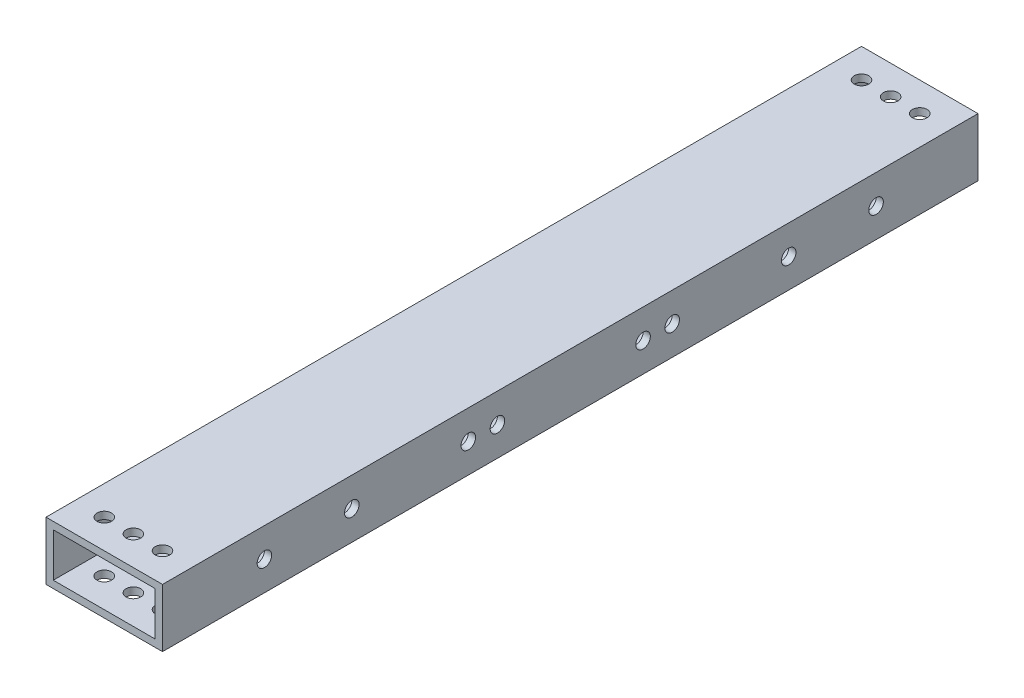
ISO-10303-21;
HEADER;
FILE_DESCRIPTION(('STEP AP214'),'2;1');
FILE_NAME('part.step','',(''),(''),'','','');
FILE_SCHEMA(('AUTOMOTIVE_DESIGN { 1 0 10303 214 1 1 1 1 }'));
ENDSEC;
DATA;
#1=APPLICATION_CONTEXT('core data for automotive mechanical design processes');
#2=APPLICATION_PROTOCOL_DEFINITION('international standard','automotive_design',2000,#1);
#3=PRODUCT_CONTEXT('',#1,'mechanical');
#4=PRODUCT('Part','Part','',(#3));
#5=PRODUCT_RELATED_PRODUCT_CATEGORY('part','',(#4));
#6=PRODUCT_DEFINITION_FORMATION('','',#4);
#7=PRODUCT_DEFINITION_CONTEXT('part definition',#1,'design');
#8=PRODUCT_DEFINITION('design','',#6,#7);
#9=PRODUCT_DEFINITION_SHAPE('','',#8);
#10=(LENGTH_UNIT() NAMED_UNIT(*) SI_UNIT(.MILLI.,.METRE.));
#11=(NAMED_UNIT(*) PLANE_ANGLE_UNIT() SI_UNIT($,.RADIAN.));
#12=(NAMED_UNIT(*) SI_UNIT($,.STERADIAN.) SOLID_ANGLE_UNIT());
#13=UNCERTAINTY_MEASURE_WITH_UNIT(LENGTH_MEASURE(1.E-05),#10,'distance_accuracy_value','');
#14=(GEOMETRIC_REPRESENTATION_CONTEXT(3) GLOBAL_UNCERTAINTY_ASSIGNED_CONTEXT((#13)) GLOBAL_UNIT_ASSIGNED_CONTEXT((#10,
#11,#12)) REPRESENTATION_CONTEXT('',''));
#15=CARTESIAN_POINT('',(0.,0.,0.));
#16=DIRECTION('',(0.,0.,1.));
#17=DIRECTION('',(1.,0.,0.));
#18=AXIS2_PLACEMENT_3D('',#15,#16,#17);
#19=CARTESIAN_POINT('',(0.,25.4,355.6));
#20=DIRECTION('',(0.,-1.,0.));
#21=DIRECTION('',(0.,0.,-1.));
#22=AXIS2_PLACEMENT_3D('',#19,#20,#21);
#23=PLANE('',#22);
#24=CARTESIAN_POINT('',(12.7,25.4,12.7));
#25=DIRECTION('',(0.,1.,0.));
#26=DIRECTION('',(0.,0.,1.));
#27=AXIS2_PLACEMENT_3D('',#24,#25,#26);
#28=CIRCLE('',#27,3.17499999999999);
#29=CARTESIAN_POINT('',(12.7,25.4,15.875));
#30=VERTEX_POINT('',#29);
#31=EDGE_CURVE('E839',#30,#30,#28,.T.);
#32=ORIENTED_EDGE('',*,*,#31,.F.);
#33=EDGE_LOOP('',(#32));
#34=FACE_BOUND('',#33,.T.);
#35=CARTESIAN_POINT('',(25.4,25.4,12.7));
#36=DIRECTION('',(0.,1.,0.));
#37=DIRECTION('',(0.,0.,1.));
#38=AXIS2_PLACEMENT_3D('',#35,#36,#37);
#39=CIRCLE('',#38,3.17499999999999);
#40=CARTESIAN_POINT('',(25.4,25.4,15.875));
#41=VERTEX_POINT('',#40);
#42=EDGE_CURVE('E284',#41,#41,#39,.T.);
#43=ORIENTED_EDGE('',*,*,#42,.F.);
#44=EDGE_LOOP('',(#43));
#45=FACE_BOUND('',#44,.T.);
#46=CARTESIAN_POINT('',(38.1,25.4,12.7));
#47=DIRECTION('',(0.,1.,0.));
#48=DIRECTION('',(0.,0.,1.));
#49=AXIS2_PLACEMENT_3D('',#46,#47,#48);
#50=CIRCLE('',#49,3.17499999999999);
#51=CARTESIAN_POINT('',(38.1,25.4,15.875));
#52=VERTEX_POINT('',#51);
#53=EDGE_CURVE('E281',#52,#52,#50,.T.);
#54=ORIENTED_EDGE('',*,*,#53,.F.);
#55=EDGE_LOOP('',(#54));
#56=FACE_BOUND('',#55,.T.);
#57=CARTESIAN_POINT('',(12.7000000000001,25.4,342.9));
#58=DIRECTION('',(0.,1.,0.));
#59=DIRECTION('',(0.,0.,1.));
#60=AXIS2_PLACEMENT_3D('',#57,#58,#59);
#61=CIRCLE('',#60,3.17499999999999);
#62=CARTESIAN_POINT('',(12.7000000000001,25.4,346.075));
#63=VERTEX_POINT('',#62);
#64=EDGE_CURVE('E303',#63,#63,#61,.T.);
#65=ORIENTED_EDGE('',*,*,#64,.F.);
#66=EDGE_LOOP('',(#65));
#67=FACE_BOUND('',#66,.T.);
#68=CARTESIAN_POINT('',(25.4000000000001,25.4,342.9));
#69=DIRECTION('',(0.,1.,0.));
#70=DIRECTION('',(0.,0.,1.));
#71=AXIS2_PLACEMENT_3D('',#68,#69,#70);
#72=CIRCLE('',#71,3.17499999999999);
#73=CARTESIAN_POINT('',(25.4000000000001,25.4,346.075));
#74=VERTEX_POINT('',#73);
#75=EDGE_CURVE('E313',#74,#74,#72,.T.);
#76=ORIENTED_EDGE('',*,*,#75,.F.);
#77=EDGE_LOOP('',(#76));
#78=FACE_BOUND('',#77,.T.);
#79=DIRECTION('',(-1.,0.,0.));
#80=VECTOR('',#79,1.);
#81=CARTESIAN_POINT('',(0.,25.4,0.));
#82=LINE('',#81,#80);
#83=CARTESIAN_POINT('',(50.8,25.4,0.));
#84=VERTEX_POINT('',#83);
#85=CARTESIAN_POINT('',(0.,25.4,0.));
#86=VERTEX_POINT('',#85);
#87=EDGE_CURVE('E169',#84,#86,#82,.T.);
#88=ORIENTED_EDGE('',*,*,#87,.T.);
#89=DIRECTION('',(0.,0.,-1.));
#90=VECTOR('',#89,1.);
#91=CARTESIAN_POINT('',(0.,25.4,355.6));
#92=LINE('',#91,#90);
#93=CARTESIAN_POINT('',(0.,25.4,355.6));
#94=VERTEX_POINT('',#93);
#95=EDGE_CURVE('E178',#94,#86,#92,.T.);
#96=ORIENTED_EDGE('',*,*,#95,.F.);
#97=DIRECTION('',(-1.,0.,0.));
#98=VECTOR('',#97,1.);
#99=CARTESIAN_POINT('',(0.,25.4,355.6));
#100=LINE('',#99,#98);
#101=CARTESIAN_POINT('',(50.8,25.4,355.6));
#102=VERTEX_POINT('',#101);
#103=EDGE_CURVE('E175',#102,#94,#100,.T.);
#104=ORIENTED_EDGE('',*,*,#103,.F.);
#105=DIRECTION('',(0.,0.,-1.));
#106=VECTOR('',#105,1.);
#107=CARTESIAN_POINT('',(50.8,25.4,355.6));
#108=LINE('',#107,#106);
#109=EDGE_CURVE('E193',#102,#84,#108,.T.);
#110=ORIENTED_EDGE('',*,*,#109,.T.);
#111=EDGE_LOOP('',(#88,#96,#104,#110));
#112=FACE_BOUND('',#111,.T.);
#113=CARTESIAN_POINT('',(38.1000000000001,25.4,342.9));
#114=DIRECTION('',(0.,1.,0.));
#115=DIRECTION('',(0.,0.,1.));
#116=AXIS2_PLACEMENT_3D('',#113,#114,#115);
#117=CIRCLE('',#116,3.17499999999998);
#118=CARTESIAN_POINT('',(38.1000000000001,25.4,346.075));
#119=VERTEX_POINT('',#118);
#120=EDGE_CURVE('E323',#119,#119,#117,.T.);
#121=ORIENTED_EDGE('',*,*,#120,.F.);
#122=EDGE_LOOP('',(#121));
#123=FACE_BOUND('',#122,.T.);
#124=ADVANCED_FACE('F45',(#34,#45,#56,#67,#78,#112,#123),#23,.F.);
#125=CARTESIAN_POINT('',(0.,0.,355.6));
#126=DIRECTION('',(0.,0.,-1.));
#127=DIRECTION('',(-1.,0.,0.));
#128=AXIS2_PLACEMENT_3D('',#125,#126,#127);
#129=PLANE('',#128);
#130=DIRECTION('',(0.,-1.,0.));
#131=VECTOR('',#130,1.);
#132=CARTESIAN_POINT('',(0.,0.,355.6));
#133=LINE('',#132,#131);
#134=CARTESIAN_POINT('',(0.,0.,355.6));
#135=VERTEX_POINT('',#134);
#136=EDGE_CURVE('E164',#94,#135,#133,.T.);
#137=ORIENTED_EDGE('',*,*,#136,.T.);
#138=DIRECTION('',(1.,0.,0.));
#139=VECTOR('',#138,1.);
#140=CARTESIAN_POINT('',(0.,0.,355.6));
#141=LINE('',#140,#139);
#142=CARTESIAN_POINT('',(50.8,0.,355.6));
#143=VERTEX_POINT('',#142);
#144=EDGE_CURVE('E168',#135,#143,#141,.T.);
#145=ORIENTED_EDGE('',*,*,#144,.T.);
#146=DIRECTION('',(0.,1.,0.));
#147=VECTOR('',#146,1.);
#148=CARTESIAN_POINT('',(50.8,0.,355.6));
#149=LINE('',#148,#147);
#150=EDGE_CURVE('E172',#143,#102,#149,.T.);
#151=ORIENTED_EDGE('',*,*,#150,.T.);
#152=ORIENTED_EDGE('',*,*,#103,.T.);
#153=EDGE_LOOP('',(#137,#145,#151,#152));
#154=FACE_BOUND('',#153,.T.);
#155=DIRECTION('',(0.,-1.,0.));
#156=VECTOR('',#155,1.);
#157=CARTESIAN_POINT('',(3.175,3.175,355.6));
#158=LINE('',#157,#156);
#159=CARTESIAN_POINT('',(3.175,22.225,355.6));
#160=VERTEX_POINT('',#159);
#161=CARTESIAN_POINT('',(3.175,3.175,355.6));
#162=VERTEX_POINT('',#161);
#163=EDGE_CURVE('E113',#160,#162,#158,.T.);
#164=ORIENTED_EDGE('',*,*,#163,.F.);
#165=DIRECTION('',(-1.,0.,0.));
#166=VECTOR('',#165,1.);
#167=CARTESIAN_POINT('',(3.175,22.225,355.6));
#168=LINE('',#167,#166);
#169=CARTESIAN_POINT('',(47.625,22.225,355.6));
#170=VERTEX_POINT('',#169);
#171=EDGE_CURVE('E140',#170,#160,#168,.T.);
#172=ORIENTED_EDGE('',*,*,#171,.F.);
#173=DIRECTION('',(0.,1.,0.));
#174=VECTOR('',#173,1.);
#175=CARTESIAN_POINT('',(47.625,3.175,355.6));
#176=LINE('',#175,#174);
#177=CARTESIAN_POINT('',(47.625,3.175,355.6));
#178=VERTEX_POINT('',#177);
#179=EDGE_CURVE('E136',#178,#170,#176,.T.);
#180=ORIENTED_EDGE('',*,*,#179,.F.);
#181=DIRECTION('',(1.,0.,0.));
#182=VECTOR('',#181,1.);
#183=CARTESIAN_POINT('',(3.175,3.175,355.6));
#184=LINE('',#183,#182);
#185=EDGE_CURVE('E122',#162,#178,#184,.T.);
#186=ORIENTED_EDGE('',*,*,#185,.F.);
#187=EDGE_LOOP('',(#164,#172,#180,#186));
#188=FACE_BOUND('',#187,.T.);
#189=ADVANCED_FACE('F135',(#154,#188),#129,.F.);
#190=CARTESIAN_POINT('',(0.,0.,0.));
#191=DIRECTION('',(0.,0.,-1.));
#192=DIRECTION('',(-1.,0.,0.));
#193=AXIS2_PLACEMENT_3D('',#190,#191,#192);
#194=PLANE('',#193);
#195=DIRECTION('',(0.,-1.,0.));
#196=VECTOR('',#195,1.);
#197=CARTESIAN_POINT('',(0.,0.,0.));
#198=LINE('',#197,#196);
#199=CARTESIAN_POINT('',(0.,0.,0.));
#200=VERTEX_POINT('',#199);
#201=EDGE_CURVE('E131',#86,#200,#198,.T.);
#202=ORIENTED_EDGE('',*,*,#201,.F.);
#203=ORIENTED_EDGE('',*,*,#87,.F.);
#204=DIRECTION('',(0.,1.,0.));
#205=VECTOR('',#204,1.);
#206=CARTESIAN_POINT('',(50.8,0.,0.));
#207=LINE('',#206,#205);
#208=CARTESIAN_POINT('',(50.8,0.,0.));
#209=VERTEX_POINT('',#208);
#210=EDGE_CURVE('E185',#209,#84,#207,.T.);
#211=ORIENTED_EDGE('',*,*,#210,.F.);
#212=DIRECTION('',(1.,0.,0.));
#213=VECTOR('',#212,1.);
#214=CARTESIAN_POINT('',(0.,0.,0.));
#215=LINE('',#214,#213);
#216=EDGE_CURVE('E182',#200,#209,#215,.T.);
#217=ORIENTED_EDGE('',*,*,#216,.F.);
#218=EDGE_LOOP('',(#202,#203,#211,#217));
#219=FACE_BOUND('',#218,.T.);
#220=DIRECTION('',(-1.,0.,0.));
#221=VECTOR('',#220,1.);
#222=CARTESIAN_POINT('',(3.175,22.225,0.));
#223=LINE('',#222,#221);
#224=CARTESIAN_POINT('',(47.625,22.225,0.));
#225=VERTEX_POINT('',#224);
#226=CARTESIAN_POINT('',(3.175,22.225,0.));
#227=VERTEX_POINT('',#226);
#228=EDGE_CURVE('E123',#225,#227,#223,.T.);
#229=ORIENTED_EDGE('',*,*,#228,.T.);
#230=DIRECTION('',(0.,-1.,0.));
#231=VECTOR('',#230,1.);
#232=CARTESIAN_POINT('',(3.175,3.175,0.));
#233=LINE('',#232,#231);
#234=CARTESIAN_POINT('',(3.175,3.175,0.));
#235=VERTEX_POINT('',#234);
#236=EDGE_CURVE('E71',#227,#235,#233,.T.);
#237=ORIENTED_EDGE('',*,*,#236,.T.);
#238=DIRECTION('',(1.,0.,0.));
#239=VECTOR('',#238,1.);
#240=CARTESIAN_POINT('',(3.175,3.175,0.));
#241=LINE('',#240,#239);
#242=CARTESIAN_POINT('',(47.625,3.175,0.));
#243=VERTEX_POINT('',#242);
#244=EDGE_CURVE('E129',#235,#243,#241,.T.);
#245=ORIENTED_EDGE('',*,*,#244,.T.);
#246=DIRECTION('',(0.,1.,0.));
#247=VECTOR('',#246,1.);
#248=CARTESIAN_POINT('',(47.625,3.175,0.));
#249=LINE('',#248,#247);
#250=EDGE_CURVE('E151',#243,#225,#249,.T.);
#251=ORIENTED_EDGE('',*,*,#250,.T.);
#252=EDGE_LOOP('',(#229,#237,#245,#251));
#253=FACE_BOUND('',#252,.T.);
#254=ADVANCED_FACE('F443',(#219,#253),#194,.T.);
#255=CARTESIAN_POINT('',(0.,0.,355.6));
#256=DIRECTION('',(1.,0.,0.));
#257=DIRECTION('',(0.,0.,-1.));
#258=AXIS2_PLACEMENT_3D('',#255,#256,#257);
#259=PLANE('',#258);
#260=CARTESIAN_POINT('',(0.,12.7000000000001,311.15));
#261=DIRECTION('',(1.,0.,0.));
#262=DIRECTION('',(0.,0.,-1.));
#263=AXIS2_PLACEMENT_3D('',#260,#261,#262);
#264=CIRCLE('',#263,3.17500000000003);
#265=CARTESIAN_POINT('',(0.,12.7000000000001,307.975));
#266=VERTEX_POINT('',#265);
#267=EDGE_CURVE('E148',#266,#266,#264,.T.);
#268=ORIENTED_EDGE('',*,*,#267,.T.);
#269=EDGE_LOOP('',(#268));
#270=FACE_BOUND('',#269,.T.);
#271=CARTESIAN_POINT('',(0.,12.7000000000001,273.05));
#272=DIRECTION('',(1.,0.,0.));
#273=DIRECTION('',(0.,0.,-1.));
#274=AXIS2_PLACEMENT_3D('',#271,#272,#273);
#275=CIRCLE('',#274,3.17499999999997);
#276=CARTESIAN_POINT('',(0.,12.7000000000001,269.875));
#277=VERTEX_POINT('',#276);
#278=EDGE_CURVE('E247',#277,#277,#275,.T.);
#279=ORIENTED_EDGE('',*,*,#278,.T.);
#280=EDGE_LOOP('',(#279));
#281=FACE_BOUND('',#280,.T.);
#282=CARTESIAN_POINT('',(0.,12.7000000000001,222.25));
#283=DIRECTION('',(1.,0.,0.));
#284=DIRECTION('',(0.,0.,-1.));
#285=AXIS2_PLACEMENT_3D('',#282,#283,#284);
#286=CIRCLE('',#285,3.175);
#287=CARTESIAN_POINT('',(0.,12.7000000000001,219.075));
#288=VERTEX_POINT('',#287);
#289=EDGE_CURVE('E241',#288,#288,#286,.T.);
#290=ORIENTED_EDGE('',*,*,#289,.T.);
#291=EDGE_LOOP('',(#290));
#292=FACE_BOUND('',#291,.T.);
#293=CARTESIAN_POINT('',(0.,12.7000000000001,146.05));
#294=DIRECTION('',(1.,0.,0.));
#295=DIRECTION('',(0.,0.,-1.));
#296=AXIS2_PLACEMENT_3D('',#293,#294,#295);
#297=CIRCLE('',#296,3.175);
#298=CARTESIAN_POINT('',(0.,12.7000000000001,142.875));
#299=VERTEX_POINT('',#298);
#300=EDGE_CURVE('E235',#299,#299,#297,.T.);
#301=ORIENTED_EDGE('',*,*,#300,.T.);
#302=EDGE_LOOP('',(#301));
#303=FACE_BOUND('',#302,.T.);
#304=CARTESIAN_POINT('',(0.,12.7000000000001,82.55));
#305=DIRECTION('',(1.,0.,0.));
#306=DIRECTION('',(0.,0.,-1.));
#307=AXIS2_PLACEMENT_3D('',#304,#305,#306);
#308=CIRCLE('',#307,3.175);
#309=CARTESIAN_POINT('',(0.,12.7000000000001,79.375));
#310=VERTEX_POINT('',#309);
#311=EDGE_CURVE('E229',#310,#310,#308,.T.);
#312=ORIENTED_EDGE('',*,*,#311,.T.);
#313=EDGE_LOOP('',(#312));
#314=FACE_BOUND('',#313,.T.);
#315=CARTESIAN_POINT('',(0.,12.7000000000001,44.45));
#316=DIRECTION('',(1.,0.,0.));
#317=DIRECTION('',(0.,0.,-1.));
#318=AXIS2_PLACEMENT_3D('',#315,#316,#317);
#319=CIRCLE('',#318,3.175);
#320=CARTESIAN_POINT('',(0.,12.7000000000001,41.275));
#321=VERTEX_POINT('',#320);
#322=EDGE_CURVE('E223',#321,#321,#319,.T.);
#323=ORIENTED_EDGE('',*,*,#322,.T.);
#324=EDGE_LOOP('',(#323));
#325=FACE_BOUND('',#324,.T.);
#326=CARTESIAN_POINT('',(0.,12.7000000000001,209.55));
#327=DIRECTION('',(1.,0.,0.));
#328=DIRECTION('',(0.,0.,-1.));
#329=AXIS2_PLACEMENT_3D('',#326,#327,#328);
#330=CIRCLE('',#329,3.17500000000003);
#331=CARTESIAN_POINT('',(0.,12.7000000000001,206.375));
#332=VERTEX_POINT('',#331);
#333=EDGE_CURVE('E217',#332,#332,#330,.T.);
#334=ORIENTED_EDGE('',*,*,#333,.T.);
#335=EDGE_LOOP('',(#334));
#336=FACE_BOUND('',#335,.T.);
#337=CARTESIAN_POINT('',(0.,12.7000000000001,133.35));
#338=DIRECTION('',(1.,0.,0.));
#339=DIRECTION('',(0.,0.,-1.));
#340=AXIS2_PLACEMENT_3D('',#337,#338,#339);
#341=CIRCLE('',#340,3.175);
#342=CARTESIAN_POINT('',(0.,12.7000000000001,130.175));
#343=VERTEX_POINT('',#342);
#344=EDGE_CURVE('E211',#343,#343,#341,.T.);
#345=ORIENTED_EDGE('',*,*,#344,.T.);
#346=EDGE_LOOP('',(#345));
#347=FACE_BOUND('',#346,.T.);
#348=ORIENTED_EDGE('',*,*,#201,.T.);
#349=DIRECTION('',(0.,0.,-1.));
#350=VECTOR('',#349,1.);
#351=CARTESIAN_POINT('',(0.,0.,355.6));
#352=LINE('',#351,#350);
#353=EDGE_CURVE('E11',#135,#200,#352,.T.);
#354=ORIENTED_EDGE('',*,*,#353,.F.);
#355=ORIENTED_EDGE('',*,*,#136,.F.);
#356=ORIENTED_EDGE('',*,*,#95,.T.);
#357=EDGE_LOOP('',(#348,#354,#355,#356));
#358=FACE_BOUND('',#357,.T.);
#359=ADVANCED_FACE('F47',(#270,#281,#292,#303,#314,#325,#336,#347,#358),#259,.F.);
#360=CARTESIAN_POINT('',(0.,0.,355.6));
#361=DIRECTION('',(0.,1.,0.));
#362=DIRECTION('',(0.,0.,1.));
#363=AXIS2_PLACEMENT_3D('',#360,#361,#362);
#364=PLANE('',#363);
#365=CARTESIAN_POINT('',(12.7,0.,12.7));
#366=DIRECTION('',(0.,1.,0.));
#367=DIRECTION('',(0.,0.,1.));
#368=AXIS2_PLACEMENT_3D('',#365,#366,#367);
#369=CIRCLE('',#368,3.17499999999998);
#370=CARTESIAN_POINT('',(12.7,0.,15.875));
#371=VERTEX_POINT('',#370);
#372=EDGE_CURVE('E461',#371,#371,#369,.T.);
#373=ORIENTED_EDGE('',*,*,#372,.T.);
#374=EDGE_LOOP('',(#373));
#375=FACE_BOUND('',#374,.T.);
#376=CARTESIAN_POINT('',(25.4,0.,12.7));
#377=DIRECTION('',(0.,1.,0.));
#378=DIRECTION('',(0.,0.,1.));
#379=AXIS2_PLACEMENT_3D('',#376,#377,#378);
#380=CIRCLE('',#379,3.17499999999999);
#381=CARTESIAN_POINT('',(25.4,0.,15.875));
#382=VERTEX_POINT('',#381);
#383=EDGE_CURVE('E275',#382,#382,#380,.T.);
#384=ORIENTED_EDGE('',*,*,#383,.T.);
#385=EDGE_LOOP('',(#384));
#386=FACE_BOUND('',#385,.T.);
#387=CARTESIAN_POINT('',(38.1,0.,12.7));
#388=DIRECTION('',(0.,1.,0.));
#389=DIRECTION('',(0.,0.,1.));
#390=AXIS2_PLACEMENT_3D('',#387,#388,#389);
#391=CIRCLE('',#390,3.17499999999998);
#392=CARTESIAN_POINT('',(38.1,0.,15.875));
#393=VERTEX_POINT('',#392);
#394=EDGE_CURVE('E270',#393,#393,#391,.T.);
#395=ORIENTED_EDGE('',*,*,#394,.T.);
#396=EDGE_LOOP('',(#395));
#397=FACE_BOUND('',#396,.T.);
#398=CARTESIAN_POINT('',(12.7000000000001,0.,342.9));
#399=DIRECTION('',(0.,1.,0.));
#400=DIRECTION('',(0.,0.,1.));
#401=AXIS2_PLACEMENT_3D('',#398,#399,#400);
#402=CIRCLE('',#401,3.17499999999999);
#403=CARTESIAN_POINT('',(12.7000000000001,0.,346.075));
#404=VERTEX_POINT('',#403);
#405=EDGE_CURVE('E265',#404,#404,#402,.T.);
#406=ORIENTED_EDGE('',*,*,#405,.T.);
#407=EDGE_LOOP('',(#406));
#408=FACE_BOUND('',#407,.T.);
#409=CARTESIAN_POINT('',(25.4000000000001,0.,342.9));
#410=DIRECTION('',(0.,1.,0.));
#411=DIRECTION('',(0.,0.,1.));
#412=AXIS2_PLACEMENT_3D('',#409,#410,#411);
#413=CIRCLE('',#412,3.17499999999998);
#414=CARTESIAN_POINT('',(25.4000000000001,0.,346.075));
#415=VERTEX_POINT('',#414);
#416=EDGE_CURVE('E259',#415,#415,#413,.T.);
#417=ORIENTED_EDGE('',*,*,#416,.T.);
#418=EDGE_LOOP('',(#417));
#419=FACE_BOUND('',#418,.T.);
#420=CARTESIAN_POINT('',(38.1000000000001,0.,342.9));
#421=DIRECTION('',(0.,1.,0.));
#422=DIRECTION('',(0.,0.,1.));
#423=AXIS2_PLACEMENT_3D('',#420,#421,#422);
#424=CIRCLE('',#423,3.17499999999998);
#425=CARTESIAN_POINT('',(38.1000000000001,0.,346.075));
#426=VERTEX_POINT('',#425);
#427=EDGE_CURVE('E253',#426,#426,#424,.T.);
#428=ORIENTED_EDGE('',*,*,#427,.T.);
#429=EDGE_LOOP('',(#428));
#430=FACE_BOUND('',#429,.T.);
#431=ORIENTED_EDGE('',*,*,#216,.T.);
#432=DIRECTION('',(0.,0.,-1.));
#433=VECTOR('',#432,1.);
#434=CARTESIAN_POINT('',(50.8,0.,355.6));
#435=LINE('',#434,#433);
#436=EDGE_CURVE('E55',#143,#209,#435,.T.);
#437=ORIENTED_EDGE('',*,*,#436,.F.);
#438=ORIENTED_EDGE('',*,*,#144,.F.);
#439=ORIENTED_EDGE('',*,*,#353,.T.);
#440=EDGE_LOOP('',(#431,#437,#438,#439));
#441=FACE_BOUND('',#440,.T.);
#442=ADVANCED_FACE('F452',(#375,#386,#397,#408,#419,#430,#441),#364,.F.);
#443=CARTESIAN_POINT('',(50.8,0.,355.6));
#444=DIRECTION('',(-1.,0.,0.));
#445=DIRECTION('',(0.,0.,1.));
#446=AXIS2_PLACEMENT_3D('',#443,#444,#445);
#447=PLANE('',#446);
#448=CARTESIAN_POINT('',(50.8,12.7000000000001,311.15));
#449=DIRECTION('',(-1.,0.,0.));
#450=DIRECTION('',(0.,0.,-1.));
#451=AXIS2_PLACEMENT_3D('',#448,#449,#450);
#452=CIRCLE('',#451,3.17500000000003);
#453=CARTESIAN_POINT('',(50.8,12.7000000000001,307.975));
#454=VERTEX_POINT('',#453);
#455=EDGE_CURVE('E333',#454,#454,#452,.T.);
#456=ORIENTED_EDGE('',*,*,#455,.T.);
#457=EDGE_LOOP('',(#456));
#458=FACE_BOUND('',#457,.T.);
#459=CARTESIAN_POINT('',(50.8,12.7000000000001,273.05));
#460=DIRECTION('',(-1.,0.,0.));
#461=DIRECTION('',(0.,0.,-1.));
#462=AXIS2_PLACEMENT_3D('',#459,#460,#461);
#463=CIRCLE('',#462,3.17499999999997);
#464=CARTESIAN_POINT('',(50.8,12.7000000000001,269.875));
#465=VERTEX_POINT('',#464);
#466=EDGE_CURVE('E354',#465,#465,#463,.T.);
#467=ORIENTED_EDGE('',*,*,#466,.T.);
#468=EDGE_LOOP('',(#467));
#469=FACE_BOUND('',#468,.T.);
#470=CARTESIAN_POINT('',(50.8,12.7000000000001,222.25));
#471=DIRECTION('',(-1.,0.,0.));
#472=DIRECTION('',(0.,0.,-1.));
#473=AXIS2_PLACEMENT_3D('',#470,#471,#472);
#474=CIRCLE('',#473,3.175);
#475=CARTESIAN_POINT('',(50.8,12.7000000000001,219.075));
#476=VERTEX_POINT('',#475);
#477=EDGE_CURVE('E343',#476,#476,#474,.T.);
#478=ORIENTED_EDGE('',*,*,#477,.T.);
#479=EDGE_LOOP('',(#478));
#480=FACE_BOUND('',#479,.T.);
#481=CARTESIAN_POINT('',(50.8,12.7000000000001,146.05));
#482=DIRECTION('',(-1.,0.,0.));
#483=DIRECTION('',(0.,0.,1.));
#484=AXIS2_PLACEMENT_3D('',#481,#482,#483);
#485=CIRCLE('',#484,3.175);
#486=CARTESIAN_POINT('',(50.8,12.7000000000001,149.225));
#487=VERTEX_POINT('',#486);
#488=EDGE_CURVE('E344',#487,#487,#485,.T.);
#489=ORIENTED_EDGE('',*,*,#488,.T.);
#490=EDGE_LOOP('',(#489));
#491=FACE_BOUND('',#490,.T.);
#492=CARTESIAN_POINT('',(50.8,12.7000000000001,82.55));
#493=DIRECTION('',(-1.,0.,0.));
#494=DIRECTION('',(0.,0.,1.));
#495=AXIS2_PLACEMENT_3D('',#492,#493,#494);
#496=CIRCLE('',#495,3.175);
#497=CARTESIAN_POINT('',(50.8,12.7000000000001,85.725));
#498=VERTEX_POINT('',#497);
#499=EDGE_CURVE('E338',#498,#498,#496,.T.);
#500=ORIENTED_EDGE('',*,*,#499,.T.);
#501=EDGE_LOOP('',(#500));
#502=FACE_BOUND('',#501,.T.);
#503=CARTESIAN_POINT('',(50.8,12.7000000000001,44.45));
#504=DIRECTION('',(-1.,0.,0.));
#505=DIRECTION('',(0.,0.,1.));
#506=AXIS2_PLACEMENT_3D('',#503,#504,#505);
#507=CIRCLE('',#506,3.175);
#508=CARTESIAN_POINT('',(50.8,12.7000000000001,47.625));
#509=VERTEX_POINT('',#508);
#510=EDGE_CURVE('E334',#509,#509,#507,.T.);
#511=ORIENTED_EDGE('',*,*,#510,.T.);
#512=EDGE_LOOP('',(#511));
#513=FACE_BOUND('',#512,.T.);
#514=CARTESIAN_POINT('',(50.8,12.7000000000001,209.55));
#515=DIRECTION('',(-1.,0.,0.));
#516=DIRECTION('',(0.,0.,-1.));
#517=AXIS2_PLACEMENT_3D('',#514,#515,#516);
#518=CIRCLE('',#517,3.17500000000003);
#519=CARTESIAN_POINT('',(50.8,12.7000000000001,206.375));
#520=VERTEX_POINT('',#519);
#521=EDGE_CURVE('E339',#520,#520,#518,.T.);
#522=ORIENTED_EDGE('',*,*,#521,.T.);
#523=EDGE_LOOP('',(#522));
#524=FACE_BOUND('',#523,.T.);
#525=CARTESIAN_POINT('',(50.8,12.7000000000001,133.35));
#526=DIRECTION('',(-1.,0.,0.));
#527=DIRECTION('',(0.,0.,1.));
#528=AXIS2_PLACEMENT_3D('',#525,#526,#527);
#529=CIRCLE('',#528,3.175);
#530=CARTESIAN_POINT('',(50.8,12.7000000000001,136.525));
#531=VERTEX_POINT('',#530);
#532=EDGE_CURVE('E205',#531,#531,#529,.T.);
#533=ORIENTED_EDGE('',*,*,#532,.T.);
#534=EDGE_LOOP('',(#533));
#535=FACE_BOUND('',#534,.T.);
#536=ORIENTED_EDGE('',*,*,#210,.T.);
#537=ORIENTED_EDGE('',*,*,#109,.F.);
#538=ORIENTED_EDGE('',*,*,#150,.F.);
#539=ORIENTED_EDGE('',*,*,#436,.T.);
#540=EDGE_LOOP('',(#536,#537,#538,#539));
#541=FACE_BOUND('',#540,.T.);
#542=ADVANCED_FACE('F450',(#458,#469,#480,#491,#502,#513,#524,#535,#541),#447,.F.);
#543=CARTESIAN_POINT('',(3.175,3.175,355.6));
#544=DIRECTION('',(1.,0.,0.));
#545=DIRECTION('',(0.,0.,-1.));
#546=AXIS2_PLACEMENT_3D('',#543,#544,#545);
#547=PLANE('',#546);
#548=CARTESIAN_POINT('',(3.175,12.7000000000001,311.15));
#549=DIRECTION('',(1.,0.,0.));
#550=DIRECTION('',(0.,0.,-1.));
#551=AXIS2_PLACEMENT_3D('',#548,#549,#550);
#552=CIRCLE('',#551,3.17500000000003);
#553=CARTESIAN_POINT('',(3.175,12.7000000000001,307.975));
#554=VERTEX_POINT('',#553);
#555=EDGE_CURVE('E246',#554,#554,#552,.T.);
#556=ORIENTED_EDGE('',*,*,#555,.F.);
#557=EDGE_LOOP('',(#556));
#558=FACE_BOUND('',#557,.T.);
#559=CARTESIAN_POINT('',(3.175,12.7000000000001,273.05));
#560=DIRECTION('',(1.,0.,0.));
#561=DIRECTION('',(0.,0.,-1.));
#562=AXIS2_PLACEMENT_3D('',#559,#560,#561);
#563=CIRCLE('',#562,3.17499999999997);
#564=CARTESIAN_POINT('',(3.175,12.7000000000001,269.875));
#565=VERTEX_POINT('',#564);
#566=EDGE_CURVE('E240',#565,#565,#563,.T.);
#567=ORIENTED_EDGE('',*,*,#566,.F.);
#568=EDGE_LOOP('',(#567));
#569=FACE_BOUND('',#568,.T.);
#570=CARTESIAN_POINT('',(3.175,12.7000000000001,222.25));
#571=DIRECTION('',(1.,0.,0.));
#572=DIRECTION('',(0.,0.,-1.));
#573=AXIS2_PLACEMENT_3D('',#570,#571,#572);
#574=CIRCLE('',#573,3.175);
#575=CARTESIAN_POINT('',(3.175,12.7000000000001,219.075));
#576=VERTEX_POINT('',#575);
#577=EDGE_CURVE('E234',#576,#576,#574,.T.);
#578=ORIENTED_EDGE('',*,*,#577,.F.);
#579=EDGE_LOOP('',(#578));
#580=FACE_BOUND('',#579,.T.);
#581=CARTESIAN_POINT('',(3.175,12.7000000000001,146.05));
#582=DIRECTION('',(1.,0.,0.));
#583=DIRECTION('',(0.,0.,-1.));
#584=AXIS2_PLACEMENT_3D('',#581,#582,#583);
#585=CIRCLE('',#584,3.175);
#586=CARTESIAN_POINT('',(3.175,12.7000000000001,142.875));
#587=VERTEX_POINT('',#586);
#588=EDGE_CURVE('E228',#587,#587,#585,.T.);
#589=ORIENTED_EDGE('',*,*,#588,.F.);
#590=EDGE_LOOP('',(#589));
#591=FACE_BOUND('',#590,.T.);
#592=CARTESIAN_POINT('',(3.175,12.7000000000001,82.55));
#593=DIRECTION('',(1.,0.,0.));
#594=DIRECTION('',(0.,0.,-1.));
#595=AXIS2_PLACEMENT_3D('',#592,#593,#594);
#596=CIRCLE('',#595,3.175);
#597=CARTESIAN_POINT('',(3.175,12.7000000000001,79.375));
#598=VERTEX_POINT('',#597);
#599=EDGE_CURVE('E222',#598,#598,#596,.T.);
#600=ORIENTED_EDGE('',*,*,#599,.F.);
#601=EDGE_LOOP('',(#600));
#602=FACE_BOUND('',#601,.T.);
#603=CARTESIAN_POINT('',(3.175,12.7000000000001,44.45));
#604=DIRECTION('',(1.,0.,0.));
#605=DIRECTION('',(0.,0.,-1.));
#606=AXIS2_PLACEMENT_3D('',#603,#604,#605);
#607=CIRCLE('',#606,3.175);
#608=CARTESIAN_POINT('',(3.175,12.7000000000001,41.275));
#609=VERTEX_POINT('',#608);
#610=EDGE_CURVE('E216',#609,#609,#607,.T.);
#611=ORIENTED_EDGE('',*,*,#610,.F.);
#612=EDGE_LOOP('',(#611));
#613=FACE_BOUND('',#612,.T.);
#614=CARTESIAN_POINT('',(3.175,12.7000000000001,209.55));
#615=DIRECTION('',(1.,0.,0.));
#616=DIRECTION('',(0.,0.,-1.));
#617=AXIS2_PLACEMENT_3D('',#614,#615,#616);
#618=CIRCLE('',#617,3.17500000000003);
#619=CARTESIAN_POINT('',(3.175,12.7000000000001,206.375));
#620=VERTEX_POINT('',#619);
#621=EDGE_CURVE('E210',#620,#620,#618,.T.);
#622=ORIENTED_EDGE('',*,*,#621,.F.);
#623=EDGE_LOOP('',(#622));
#624=FACE_BOUND('',#623,.T.);
#625=CARTESIAN_POINT('',(3.175,12.7000000000001,133.35));
#626=DIRECTION('',(1.,0.,0.));
#627=DIRECTION('',(0.,0.,-1.));
#628=AXIS2_PLACEMENT_3D('',#625,#626,#627);
#629=CIRCLE('',#628,3.175);
#630=CARTESIAN_POINT('',(3.175,12.7000000000001,130.175));
#631=VERTEX_POINT('',#630);
#632=EDGE_CURVE('E204',#631,#631,#629,.T.);
#633=ORIENTED_EDGE('',*,*,#632,.F.);
#634=EDGE_LOOP('',(#633));
#635=FACE_BOUND('',#634,.T.);
#636=ORIENTED_EDGE('',*,*,#236,.F.);
#637=DIRECTION('',(0.,0.,-1.));
#638=VECTOR('',#637,1.);
#639=CARTESIAN_POINT('',(3.175,22.225,355.6));
#640=LINE('',#639,#638);
#641=EDGE_CURVE('E117',#160,#227,#640,.T.);
#642=ORIENTED_EDGE('',*,*,#641,.F.);
#643=ORIENTED_EDGE('',*,*,#163,.T.);
#644=DIRECTION('',(0.,0.,-1.));
#645=VECTOR('',#644,1.);
#646=CARTESIAN_POINT('',(3.175,3.175,355.6));
#647=LINE('',#646,#645);
#648=EDGE_CURVE('E116',#162,#235,#647,.T.);
#649=ORIENTED_EDGE('',*,*,#648,.T.);
#650=EDGE_LOOP('',(#636,#642,#643,#649));
#651=FACE_BOUND('',#650,.T.);
#652=ADVANCED_FACE('F115',(#558,#569,#580,#591,#602,#613,#624,#635,#651),#547,.T.);
#653=CARTESIAN_POINT('',(3.175,3.175,355.6));
#654=DIRECTION('',(0.,1.,0.));
#655=DIRECTION('',(0.,0.,1.));
#656=AXIS2_PLACEMENT_3D('',#653,#654,#655);
#657=PLANE('',#656);
#658=CARTESIAN_POINT('',(12.7,3.175,12.7));
#659=DIRECTION('',(0.,1.,0.));
#660=DIRECTION('',(0.,0.,1.));
#661=AXIS2_PLACEMENT_3D('',#658,#659,#660);
#662=CIRCLE('',#661,3.17499999999999);
#663=CARTESIAN_POINT('',(12.7,3.175,15.875));
#664=VERTEX_POINT('',#663);
#665=EDGE_CURVE('E290',#664,#664,#662,.T.);
#666=ORIENTED_EDGE('',*,*,#665,.F.);
#667=EDGE_LOOP('',(#666));
#668=FACE_BOUND('',#667,.T.);
#669=CARTESIAN_POINT('',(25.4,3.175,12.7));
#670=DIRECTION('',(0.,1.,0.));
#671=DIRECTION('',(0.,0.,1.));
#672=AXIS2_PLACEMENT_3D('',#669,#670,#671);
#673=CIRCLE('',#672,3.17499999999999);
#674=CARTESIAN_POINT('',(25.4,3.175,15.875));
#675=VERTEX_POINT('',#674);
#676=EDGE_CURVE('E274',#675,#675,#673,.T.);
#677=ORIENTED_EDGE('',*,*,#676,.F.);
#678=EDGE_LOOP('',(#677));
#679=FACE_BOUND('',#678,.T.);
#680=CARTESIAN_POINT('',(38.1,3.175,12.7));
#681=DIRECTION('',(0.,1.,0.));
#682=DIRECTION('',(0.,0.,1.));
#683=AXIS2_PLACEMENT_3D('',#680,#681,#682);
#684=CIRCLE('',#683,3.17499999999999);
#685=CARTESIAN_POINT('',(38.1,3.175,15.875));
#686=VERTEX_POINT('',#685);
#687=EDGE_CURVE('E269',#686,#686,#684,.T.);
#688=ORIENTED_EDGE('',*,*,#687,.F.);
#689=EDGE_LOOP('',(#688));
#690=FACE_BOUND('',#689,.T.);
#691=CARTESIAN_POINT('',(12.7000000000001,3.175,342.9));
#692=DIRECTION('',(0.,1.,0.));
#693=DIRECTION('',(0.,0.,1.));
#694=AXIS2_PLACEMENT_3D('',#691,#692,#693);
#695=CIRCLE('',#694,3.17499999999999);
#696=CARTESIAN_POINT('',(12.7000000000001,3.175,346.075));
#697=VERTEX_POINT('',#696);
#698=EDGE_CURVE('E264',#697,#697,#695,.T.);
#699=ORIENTED_EDGE('',*,*,#698,.F.);
#700=EDGE_LOOP('',(#699));
#701=FACE_BOUND('',#700,.T.);
#702=CARTESIAN_POINT('',(25.4000000000001,3.175,342.9));
#703=DIRECTION('',(0.,1.,0.));
#704=DIRECTION('',(0.,0.,1.));
#705=AXIS2_PLACEMENT_3D('',#702,#703,#704);
#706=CIRCLE('',#705,3.17499999999999);
#707=CARTESIAN_POINT('',(25.4000000000001,3.175,346.075));
#708=VERTEX_POINT('',#707);
#709=EDGE_CURVE('E258',#708,#708,#706,.T.);
#710=ORIENTED_EDGE('',*,*,#709,.F.);
#711=EDGE_LOOP('',(#710));
#712=FACE_BOUND('',#711,.T.);
#713=CARTESIAN_POINT('',(38.1000000000001,3.175,342.9));
#714=DIRECTION('',(0.,1.,0.));
#715=DIRECTION('',(0.,0.,1.));
#716=AXIS2_PLACEMENT_3D('',#713,#714,#715);
#717=CIRCLE('',#716,3.17499999999998);
#718=CARTESIAN_POINT('',(38.1000000000001,3.175,346.075));
#719=VERTEX_POINT('',#718);
#720=EDGE_CURVE('E248',#719,#719,#717,.T.);
#721=ORIENTED_EDGE('',*,*,#720,.F.);
#722=EDGE_LOOP('',(#721));
#723=FACE_BOUND('',#722,.T.);
#724=ORIENTED_EDGE('',*,*,#244,.F.);
#725=ORIENTED_EDGE('',*,*,#648,.F.);
#726=ORIENTED_EDGE('',*,*,#185,.T.);
#727=DIRECTION('',(0.,0.,-1.));
#728=VECTOR('',#727,1.);
#729=CARTESIAN_POINT('',(47.625,3.175,355.6));
#730=LINE('',#729,#728);
#731=EDGE_CURVE('E132',#178,#243,#730,.T.);
#732=ORIENTED_EDGE('',*,*,#731,.T.);
#733=EDGE_LOOP('',(#724,#725,#726,#732));
#734=FACE_BOUND('',#733,.T.);
#735=ADVANCED_FACE('F126',(#668,#679,#690,#701,#712,#723,#734),#657,.T.);
#736=CARTESIAN_POINT('',(47.625,3.175,355.6));
#737=DIRECTION('',(-1.,0.,0.));
#738=DIRECTION('',(0.,0.,1.));
#739=AXIS2_PLACEMENT_3D('',#736,#737,#738);
#740=PLANE('',#739);
#741=CARTESIAN_POINT('',(47.625,12.7000000000001,311.15));
#742=DIRECTION('',(-1.,0.,0.));
#743=DIRECTION('',(0.,0.,1.));
#744=AXIS2_PLACEMENT_3D('',#741,#742,#743);
#745=CIRCLE('',#744,3.17500000000003);
#746=CARTESIAN_POINT('',(47.625,12.7000000000001,314.325));
#747=VERTEX_POINT('',#746);
#748=EDGE_CURVE('E242',#747,#747,#745,.T.);
#749=ORIENTED_EDGE('',*,*,#748,.F.);
#750=EDGE_LOOP('',(#749));
#751=FACE_BOUND('',#750,.T.);
#752=CARTESIAN_POINT('',(47.625,12.7000000000001,273.05));
#753=DIRECTION('',(-1.,0.,0.));
#754=DIRECTION('',(0.,0.,1.));
#755=AXIS2_PLACEMENT_3D('',#752,#753,#754);
#756=CIRCLE('',#755,3.17499999999997);
#757=CARTESIAN_POINT('',(47.625,12.7000000000001,276.225));
#758=VERTEX_POINT('',#757);
#759=EDGE_CURVE('E236',#758,#758,#756,.T.);
#760=ORIENTED_EDGE('',*,*,#759,.F.);
#761=EDGE_LOOP('',(#760));
#762=FACE_BOUND('',#761,.T.);
#763=CARTESIAN_POINT('',(47.625,12.7000000000001,222.25));
#764=DIRECTION('',(-1.,0.,0.));
#765=DIRECTION('',(0.,0.,1.));
#766=AXIS2_PLACEMENT_3D('',#763,#764,#765);
#767=CIRCLE('',#766,3.175);
#768=CARTESIAN_POINT('',(47.625,12.7000000000001,225.425));
#769=VERTEX_POINT('',#768);
#770=EDGE_CURVE('E230',#769,#769,#767,.T.);
#771=ORIENTED_EDGE('',*,*,#770,.F.);
#772=EDGE_LOOP('',(#771));
#773=FACE_BOUND('',#772,.T.);
#774=CARTESIAN_POINT('',(47.625,12.7000000000001,146.05));
#775=DIRECTION('',(-1.,0.,0.));
#776=DIRECTION('',(0.,0.,1.));
#777=AXIS2_PLACEMENT_3D('',#774,#775,#776);
#778=CIRCLE('',#777,3.175);
#779=CARTESIAN_POINT('',(47.625,12.7000000000001,149.225));
#780=VERTEX_POINT('',#779);
#781=EDGE_CURVE('E224',#780,#780,#778,.T.);
#782=ORIENTED_EDGE('',*,*,#781,.F.);
#783=EDGE_LOOP('',(#782));
#784=FACE_BOUND('',#783,.T.);
#785=CARTESIAN_POINT('',(47.625,12.7000000000001,82.55));
#786=DIRECTION('',(-1.,0.,0.));
#787=DIRECTION('',(0.,0.,1.));
#788=AXIS2_PLACEMENT_3D('',#785,#786,#787);
#789=CIRCLE('',#788,3.175);
#790=CARTESIAN_POINT('',(47.625,12.7000000000001,85.725));
#791=VERTEX_POINT('',#790);
#792=EDGE_CURVE('E218',#791,#791,#789,.T.);
#793=ORIENTED_EDGE('',*,*,#792,.F.);
#794=EDGE_LOOP('',(#793));
#795=FACE_BOUND('',#794,.T.);
#796=CARTESIAN_POINT('',(47.625,12.7000000000001,44.45));
#797=DIRECTION('',(-1.,0.,0.));
#798=DIRECTION('',(0.,0.,1.));
#799=AXIS2_PLACEMENT_3D('',#796,#797,#798);
#800=CIRCLE('',#799,3.175);
#801=CARTESIAN_POINT('',(47.625,12.7000000000001,47.625));
#802=VERTEX_POINT('',#801);
#803=EDGE_CURVE('E212',#802,#802,#800,.T.);
#804=ORIENTED_EDGE('',*,*,#803,.F.);
#805=EDGE_LOOP('',(#804));
#806=FACE_BOUND('',#805,.T.);
#807=CARTESIAN_POINT('',(47.625,12.7000000000001,209.55));
#808=DIRECTION('',(-1.,0.,0.));
#809=DIRECTION('',(0.,0.,1.));
#810=AXIS2_PLACEMENT_3D('',#807,#808,#809);
#811=CIRCLE('',#810,3.17500000000003);
#812=CARTESIAN_POINT('',(47.625,12.7000000000001,212.725));
#813=VERTEX_POINT('',#812);
#814=EDGE_CURVE('E206',#813,#813,#811,.T.);
#815=ORIENTED_EDGE('',*,*,#814,.F.);
#816=EDGE_LOOP('',(#815));
#817=FACE_BOUND('',#816,.T.);
#818=CARTESIAN_POINT('',(47.625,12.7000000000001,133.35));
#819=DIRECTION('',(-1.,0.,0.));
#820=DIRECTION('',(0.,0.,1.));
#821=AXIS2_PLACEMENT_3D('',#818,#819,#820);
#822=CIRCLE('',#821,3.175);
#823=CARTESIAN_POINT('',(47.625,12.7000000000001,136.525));
#824=VERTEX_POINT('',#823);
#825=EDGE_CURVE('E200',#824,#824,#822,.T.);
#826=ORIENTED_EDGE('',*,*,#825,.F.);
#827=EDGE_LOOP('',(#826));
#828=FACE_BOUND('',#827,.T.);
#829=ORIENTED_EDGE('',*,*,#250,.F.);
#830=ORIENTED_EDGE('',*,*,#731,.F.);
#831=ORIENTED_EDGE('',*,*,#179,.T.);
#832=DIRECTION('',(0.,0.,-1.));
#833=VECTOR('',#832,1.);
#834=CARTESIAN_POINT('',(47.625,22.225,355.6));
#835=LINE('',#834,#833);
#836=EDGE_CURVE('E63',#170,#225,#835,.T.);
#837=ORIENTED_EDGE('',*,*,#836,.T.);
#838=EDGE_LOOP('',(#829,#830,#831,#837));
#839=FACE_BOUND('',#838,.T.);
#840=ADVANCED_FACE('F552',(#751,#762,#773,#784,#795,#806,#817,#828,#839),#740,.T.);
#841=CARTESIAN_POINT('',(3.175,22.225,355.6));
#842=DIRECTION('',(0.,-1.,0.));
#843=DIRECTION('',(0.,0.,-1.));
#844=AXIS2_PLACEMENT_3D('',#841,#842,#843);
#845=PLANE('',#844);
#846=CARTESIAN_POINT('',(12.7,22.225,12.7));
#847=DIRECTION('',(0.,-1.,0.));
#848=DIRECTION('',(0.,0.,-1.));
#849=AXIS2_PLACEMENT_3D('',#846,#847,#848);
#850=CIRCLE('',#849,3.17499999999999);
#851=CARTESIAN_POINT('',(12.7,22.225,9.52500000000001));
#852=VERTEX_POINT('',#851);
#853=EDGE_CURVE('E49',#852,#852,#850,.T.);
#854=ORIENTED_EDGE('',*,*,#853,.F.);
#855=EDGE_LOOP('',(#854));
#856=FACE_BOUND('',#855,.T.);
#857=CARTESIAN_POINT('',(25.4,22.225,12.7));
#858=DIRECTION('',(0.,-1.,0.));
#859=DIRECTION('',(0.,0.,-1.));
#860=AXIS2_PLACEMENT_3D('',#857,#858,#859);
#861=CIRCLE('',#860,3.17499999999999);
#862=CARTESIAN_POINT('',(25.4,22.225,9.52500000000001));
#863=VERTEX_POINT('',#862);
#864=EDGE_CURVE('E271',#863,#863,#861,.T.);
#865=ORIENTED_EDGE('',*,*,#864,.F.);
#866=EDGE_LOOP('',(#865));
#867=FACE_BOUND('',#866,.T.);
#868=CARTESIAN_POINT('',(38.1,22.225,12.7));
#869=DIRECTION('',(0.,-1.,0.));
#870=DIRECTION('',(0.,0.,-1.));
#871=AXIS2_PLACEMENT_3D('',#868,#869,#870);
#872=CIRCLE('',#871,3.17499999999999);
#873=CARTESIAN_POINT('',(38.1,22.225,9.52500000000001));
#874=VERTEX_POINT('',#873);
#875=EDGE_CURVE('E266',#874,#874,#872,.T.);
#876=ORIENTED_EDGE('',*,*,#875,.F.);
#877=EDGE_LOOP('',(#876));
#878=FACE_BOUND('',#877,.T.);
#879=CARTESIAN_POINT('',(12.7000000000001,22.225,342.9));
#880=DIRECTION('',(0.,-1.,0.));
#881=DIRECTION('',(0.,0.,-1.));
#882=AXIS2_PLACEMENT_3D('',#879,#880,#881);
#883=CIRCLE('',#882,3.17499999999999);
#884=CARTESIAN_POINT('',(12.7000000000001,22.225,339.725));
#885=VERTEX_POINT('',#884);
#886=EDGE_CURVE('E260',#885,#885,#883,.T.);
#887=ORIENTED_EDGE('',*,*,#886,.F.);
#888=EDGE_LOOP('',(#887));
#889=FACE_BOUND('',#888,.T.);
#890=CARTESIAN_POINT('',(25.4000000000001,22.225,342.9));
#891=DIRECTION('',(0.,-1.,0.));
#892=DIRECTION('',(0.,0.,-1.));
#893=AXIS2_PLACEMENT_3D('',#890,#891,#892);
#894=CIRCLE('',#893,3.17499999999999);
#895=CARTESIAN_POINT('',(25.4000000000001,22.225,339.725));
#896=VERTEX_POINT('',#895);
#897=EDGE_CURVE('E254',#896,#896,#894,.T.);
#898=ORIENTED_EDGE('',*,*,#897,.F.);
#899=EDGE_LOOP('',(#898));
#900=FACE_BOUND('',#899,.T.);
#901=CARTESIAN_POINT('',(38.1000000000001,22.225,342.9));
#902=DIRECTION('',(0.,-1.,0.));
#903=DIRECTION('',(0.,0.,-1.));
#904=AXIS2_PLACEMENT_3D('',#901,#902,#903);
#905=CIRCLE('',#904,3.17499999999998);
#906=CARTESIAN_POINT('',(38.1000000000001,22.225,339.725));
#907=VERTEX_POINT('',#906);
#908=EDGE_CURVE('E252',#907,#907,#905,.T.);
#909=ORIENTED_EDGE('',*,*,#908,.F.);
#910=EDGE_LOOP('',(#909));
#911=FACE_BOUND('',#910,.T.);
#912=ORIENTED_EDGE('',*,*,#228,.F.);
#913=ORIENTED_EDGE('',*,*,#836,.F.);
#914=ORIENTED_EDGE('',*,*,#171,.T.);
#915=ORIENTED_EDGE('',*,*,#641,.T.);
#916=EDGE_LOOP('',(#912,#913,#914,#915));
#917=FACE_BOUND('',#916,.T.);
#918=ADVANCED_FACE('F546',(#856,#867,#878,#889,#900,#911,#917),#845,.T.);
#919=CARTESIAN_POINT('',(50.8,12.7000000000001,133.35));
#920=DIRECTION('',(-1.,0.,0.));
#921=DIRECTION('',(0.,0.,1.));
#922=AXIS2_PLACEMENT_3D('',#919,#920,#921);
#923=CYLINDRICAL_SURFACE('',#922,3.175);
#924=ORIENTED_EDGE('',*,*,#825,.T.);
#925=EDGE_LOOP('',(#924));
#926=FACE_BOUND('',#925,.T.);
#927=ORIENTED_EDGE('',*,*,#532,.F.);
#928=EDGE_LOOP('',(#927));
#929=FACE_BOUND('',#928,.T.);
#930=ADVANCED_FACE('F509',(#926,#929),#923,.F.);
#931=CARTESIAN_POINT('',(50.8,12.7000000000001,209.55));
#932=DIRECTION('',(-1.,0.,0.));
#933=DIRECTION('',(0.,0.,1.));
#934=AXIS2_PLACEMENT_3D('',#931,#932,#933);
#935=CYLINDRICAL_SURFACE('',#934,3.17500000000003);
#936=ORIENTED_EDGE('',*,*,#814,.T.);
#937=EDGE_LOOP('',(#936));
#938=FACE_BOUND('',#937,.T.);
#939=ORIENTED_EDGE('',*,*,#521,.F.);
#940=EDGE_LOOP('',(#939));
#941=FACE_BOUND('',#940,.T.);
#942=ADVANCED_FACE('F504',(#938,#941),#935,.F.);
#943=CARTESIAN_POINT('',(50.8,12.7000000000001,44.45));
#944=DIRECTION('',(-1.,0.,0.));
#945=DIRECTION('',(0.,0.,1.));
#946=AXIS2_PLACEMENT_3D('',#943,#944,#945);
#947=CYLINDRICAL_SURFACE('',#946,3.175);
#948=ORIENTED_EDGE('',*,*,#803,.T.);
#949=EDGE_LOOP('',(#948));
#950=FACE_BOUND('',#949,.T.);
#951=ORIENTED_EDGE('',*,*,#510,.F.);
#952=EDGE_LOOP('',(#951));
#953=FACE_BOUND('',#952,.T.);
#954=ADVANCED_FACE('F500',(#950,#953),#947,.F.);
#955=CARTESIAN_POINT('',(50.8,12.7000000000001,82.55));
#956=DIRECTION('',(-1.,0.,0.));
#957=DIRECTION('',(0.,0.,1.));
#958=AXIS2_PLACEMENT_3D('',#955,#956,#957);
#959=CYLINDRICAL_SURFACE('',#958,3.175);
#960=ORIENTED_EDGE('',*,*,#792,.T.);
#961=EDGE_LOOP('',(#960));
#962=FACE_BOUND('',#961,.T.);
#963=ORIENTED_EDGE('',*,*,#499,.F.);
#964=EDGE_LOOP('',(#963));
#965=FACE_BOUND('',#964,.T.);
#966=ADVANCED_FACE('F503',(#962,#965),#959,.F.);
#967=CARTESIAN_POINT('',(50.8,12.7000000000001,146.05));
#968=DIRECTION('',(-1.,0.,0.));
#969=DIRECTION('',(0.,0.,1.));
#970=AXIS2_PLACEMENT_3D('',#967,#968,#969);
#971=CYLINDRICAL_SURFACE('',#970,3.175);
#972=ORIENTED_EDGE('',*,*,#781,.T.);
#973=EDGE_LOOP('',(#972));
#974=FACE_BOUND('',#973,.T.);
#975=ORIENTED_EDGE('',*,*,#488,.F.);
#976=EDGE_LOOP('',(#975));
#977=FACE_BOUND('',#976,.T.);
#978=ADVANCED_FACE('F512',(#974,#977),#971,.F.);
#979=CARTESIAN_POINT('',(50.8,12.7000000000001,222.25));
#980=DIRECTION('',(-1.,0.,0.));
#981=DIRECTION('',(0.,0.,1.));
#982=AXIS2_PLACEMENT_3D('',#979,#980,#981);
#983=CYLINDRICAL_SURFACE('',#982,3.175);
#984=ORIENTED_EDGE('',*,*,#770,.T.);
#985=EDGE_LOOP('',(#984));
#986=FACE_BOUND('',#985,.T.);
#987=ORIENTED_EDGE('',*,*,#477,.F.);
#988=EDGE_LOOP('',(#987));
#989=FACE_BOUND('',#988,.T.);
#990=ADVANCED_FACE('F515',(#986,#989),#983,.F.);
#991=CARTESIAN_POINT('',(50.8,12.7000000000001,273.05));
#992=DIRECTION('',(-1.,0.,0.));
#993=DIRECTION('',(0.,0.,1.));
#994=AXIS2_PLACEMENT_3D('',#991,#992,#993);
#995=CYLINDRICAL_SURFACE('',#994,3.17499999999997);
#996=ORIENTED_EDGE('',*,*,#759,.T.);
#997=EDGE_LOOP('',(#996));
#998=FACE_BOUND('',#997,.T.);
#999=ORIENTED_EDGE('',*,*,#466,.F.);
#1000=EDGE_LOOP('',(#999));
#1001=FACE_BOUND('',#1000,.T.);
#1002=ADVANCED_FACE('F432',(#998,#1001),#995,.F.);
#1003=CARTESIAN_POINT('',(50.8,12.7000000000001,311.15));
#1004=DIRECTION('',(-1.,0.,0.));
#1005=DIRECTION('',(0.,0.,1.));
#1006=AXIS2_PLACEMENT_3D('',#1003,#1004,#1005);
#1007=CYLINDRICAL_SURFACE('',#1006,3.17500000000003);
#1008=ORIENTED_EDGE('',*,*,#748,.T.);
#1009=EDGE_LOOP('',(#1008));
#1010=FACE_BOUND('',#1009,.T.);
#1011=ORIENTED_EDGE('',*,*,#455,.F.);
#1012=EDGE_LOOP('',(#1011));
#1013=FACE_BOUND('',#1012,.T.);
#1014=ADVANCED_FACE('F420',(#1010,#1013),#1007,.F.);
#1015=ORIENTED_EDGE('',*,*,#632,.T.);
#1016=EDGE_LOOP('',(#1015));
#1017=FACE_BOUND('',#1016,.T.);
#1018=ORIENTED_EDGE('',*,*,#344,.F.);
#1019=EDGE_LOOP('',(#1018));
#1020=FACE_BOUND('',#1019,.T.);
#1021=ADVANCED_FACE('F435',(#1017,#1020),#923,.F.);
#1022=ORIENTED_EDGE('',*,*,#621,.T.);
#1023=EDGE_LOOP('',(#1022));
#1024=FACE_BOUND('',#1023,.T.);
#1025=ORIENTED_EDGE('',*,*,#333,.F.);
#1026=EDGE_LOOP('',(#1025));
#1027=FACE_BOUND('',#1026,.T.);
#1028=ADVANCED_FACE('F511',(#1024,#1027),#935,.F.);
#1029=ORIENTED_EDGE('',*,*,#610,.T.);
#1030=EDGE_LOOP('',(#1029));
#1031=FACE_BOUND('',#1030,.T.);
#1032=ORIENTED_EDGE('',*,*,#322,.F.);
#1033=EDGE_LOOP('',(#1032));
#1034=FACE_BOUND('',#1033,.T.);
#1035=ADVANCED_FACE('F506',(#1031,#1034),#947,.F.);
#1036=ORIENTED_EDGE('',*,*,#599,.T.);
#1037=EDGE_LOOP('',(#1036));
#1038=FACE_BOUND('',#1037,.T.);
#1039=ORIENTED_EDGE('',*,*,#311,.F.);
#1040=EDGE_LOOP('',(#1039));
#1041=FACE_BOUND('',#1040,.T.);
#1042=ADVANCED_FACE('F521',(#1038,#1041),#959,.F.);
#1043=ORIENTED_EDGE('',*,*,#588,.T.);
#1044=EDGE_LOOP('',(#1043));
#1045=FACE_BOUND('',#1044,.T.);
#1046=ORIENTED_EDGE('',*,*,#300,.F.);
#1047=EDGE_LOOP('',(#1046));
#1048=FACE_BOUND('',#1047,.T.);
#1049=ADVANCED_FACE('F517',(#1045,#1048),#971,.F.);
#1050=ORIENTED_EDGE('',*,*,#577,.T.);
#1051=EDGE_LOOP('',(#1050));
#1052=FACE_BOUND('',#1051,.T.);
#1053=ORIENTED_EDGE('',*,*,#289,.F.);
#1054=EDGE_LOOP('',(#1053));
#1055=FACE_BOUND('',#1054,.T.);
#1056=ADVANCED_FACE('F429',(#1052,#1055),#983,.F.);
#1057=ORIENTED_EDGE('',*,*,#566,.T.);
#1058=EDGE_LOOP('',(#1057));
#1059=FACE_BOUND('',#1058,.T.);
#1060=ORIENTED_EDGE('',*,*,#278,.F.);
#1061=EDGE_LOOP('',(#1060));
#1062=FACE_BOUND('',#1061,.T.);
#1063=ADVANCED_FACE('F417',(#1059,#1062),#995,.F.);
#1064=ORIENTED_EDGE('',*,*,#555,.T.);
#1065=EDGE_LOOP('',(#1064));
#1066=FACE_BOUND('',#1065,.T.);
#1067=ORIENTED_EDGE('',*,*,#267,.F.);
#1068=EDGE_LOOP('',(#1067));
#1069=FACE_BOUND('',#1068,.T.);
#1070=ADVANCED_FACE('F414',(#1066,#1069),#1007,.F.);
#1071=CARTESIAN_POINT('',(38.1000000000001,25.4,342.9));
#1072=DIRECTION('',(0.,1.,0.));
#1073=DIRECTION('',(0.,0.,1.));
#1074=AXIS2_PLACEMENT_3D('',#1071,#1072,#1073);
#1075=CYLINDRICAL_SURFACE('',#1074,3.17499999999998);
#1076=ORIENTED_EDGE('',*,*,#720,.T.);
#1077=EDGE_LOOP('',(#1076));
#1078=FACE_BOUND('',#1077,.T.);
#1079=ORIENTED_EDGE('',*,*,#427,.F.);
#1080=EDGE_LOOP('',(#1079));
#1081=FACE_BOUND('',#1080,.T.);
#1082=ADVANCED_FACE('F416',(#1078,#1081),#1075,.F.);
#1083=ORIENTED_EDGE('',*,*,#908,.T.);
#1084=EDGE_LOOP('',(#1083));
#1085=FACE_BOUND('',#1084,.T.);
#1086=ORIENTED_EDGE('',*,*,#120,.T.);
#1087=EDGE_LOOP('',(#1086));
#1088=FACE_BOUND('',#1087,.T.);
#1089=ADVANCED_FACE('F426',(#1085,#1088),#1075,.F.);
#1090=CARTESIAN_POINT('',(25.4000000000001,25.4,342.9));
#1091=DIRECTION('',(0.,1.,0.));
#1092=DIRECTION('',(0.,0.,1.));
#1093=AXIS2_PLACEMENT_3D('',#1090,#1091,#1092);
#1094=CYLINDRICAL_SURFACE('',#1093,3.17499999999999);
#1095=ORIENTED_EDGE('',*,*,#897,.T.);
#1096=EDGE_LOOP('',(#1095));
#1097=FACE_BOUND('',#1096,.T.);
#1098=ORIENTED_EDGE('',*,*,#75,.T.);
#1099=EDGE_LOOP('',(#1098));
#1100=FACE_BOUND('',#1099,.T.);
#1101=ADVANCED_FACE('F490',(#1097,#1100),#1094,.F.);
#1102=ORIENTED_EDGE('',*,*,#709,.T.);
#1103=EDGE_LOOP('',(#1102));
#1104=FACE_BOUND('',#1103,.T.);
#1105=ORIENTED_EDGE('',*,*,#416,.F.);
#1106=EDGE_LOOP('',(#1105));
#1107=FACE_BOUND('',#1106,.T.);
#1108=ADVANCED_FACE('F495',(#1104,#1107),#1094,.F.);
#1109=CARTESIAN_POINT('',(12.7000000000001,25.4,342.9));
#1110=DIRECTION('',(0.,1.,0.));
#1111=DIRECTION('',(0.,0.,1.));
#1112=AXIS2_PLACEMENT_3D('',#1109,#1110,#1111);
#1113=CYLINDRICAL_SURFACE('',#1112,3.17499999999999);
#1114=ORIENTED_EDGE('',*,*,#886,.T.);
#1115=EDGE_LOOP('',(#1114));
#1116=FACE_BOUND('',#1115,.T.);
#1117=ORIENTED_EDGE('',*,*,#64,.T.);
#1118=EDGE_LOOP('',(#1117));
#1119=FACE_BOUND('',#1118,.T.);
#1120=ADVANCED_FACE('F759',(#1116,#1119),#1113,.F.);
#1121=ORIENTED_EDGE('',*,*,#698,.T.);
#1122=EDGE_LOOP('',(#1121));
#1123=FACE_BOUND('',#1122,.T.);
#1124=ORIENTED_EDGE('',*,*,#405,.F.);
#1125=EDGE_LOOP('',(#1124));
#1126=FACE_BOUND('',#1125,.T.);
#1127=ADVANCED_FACE('F768',(#1123,#1126),#1113,.F.);
#1128=CARTESIAN_POINT('',(38.1,25.4,12.7));
#1129=DIRECTION('',(0.,1.,0.));
#1130=DIRECTION('',(0.,0.,1.));
#1131=AXIS2_PLACEMENT_3D('',#1128,#1129,#1130);
#1132=CYLINDRICAL_SURFACE('',#1131,3.17499999999999);
#1133=ORIENTED_EDGE('',*,*,#875,.T.);
#1134=EDGE_LOOP('',(#1133));
#1135=FACE_BOUND('',#1134,.T.);
#1136=ORIENTED_EDGE('',*,*,#53,.T.);
#1137=EDGE_LOOP('',(#1136));
#1138=FACE_BOUND('',#1137,.T.);
#1139=ADVANCED_FACE('F777',(#1135,#1138),#1132,.F.);
#1140=ORIENTED_EDGE('',*,*,#687,.T.);
#1141=EDGE_LOOP('',(#1140));
#1142=FACE_BOUND('',#1141,.T.);
#1143=ORIENTED_EDGE('',*,*,#394,.F.);
#1144=EDGE_LOOP('',(#1143));
#1145=FACE_BOUND('',#1144,.T.);
#1146=ADVANCED_FACE('F786',(#1142,#1145),#1132,.F.);
#1147=CARTESIAN_POINT('',(25.4,25.4,12.7));
#1148=DIRECTION('',(0.,1.,0.));
#1149=DIRECTION('',(0.,0.,1.));
#1150=AXIS2_PLACEMENT_3D('',#1147,#1148,#1149);
#1151=CYLINDRICAL_SURFACE('',#1150,3.17499999999999);
#1152=ORIENTED_EDGE('',*,*,#864,.T.);
#1153=EDGE_LOOP('',(#1152));
#1154=FACE_BOUND('',#1153,.T.);
#1155=ORIENTED_EDGE('',*,*,#42,.T.);
#1156=EDGE_LOOP('',(#1155));
#1157=FACE_BOUND('',#1156,.T.);
#1158=ADVANCED_FACE('F796',(#1154,#1157),#1151,.F.);
#1159=ORIENTED_EDGE('',*,*,#676,.T.);
#1160=EDGE_LOOP('',(#1159));
#1161=FACE_BOUND('',#1160,.T.);
#1162=ORIENTED_EDGE('',*,*,#383,.F.);
#1163=EDGE_LOOP('',(#1162));
#1164=FACE_BOUND('',#1163,.T.);
#1165=ADVANCED_FACE('F805',(#1161,#1164),#1151,.F.);
#1166=CARTESIAN_POINT('',(12.7,25.4,12.7));
#1167=DIRECTION('',(0.,1.,0.));
#1168=DIRECTION('',(0.,0.,1.));
#1169=AXIS2_PLACEMENT_3D('',#1166,#1167,#1168);
#1170=CYLINDRICAL_SURFACE('',#1169,3.17499999999999);
#1171=ORIENTED_EDGE('',*,*,#853,.T.);
#1172=EDGE_LOOP('',(#1171));
#1173=FACE_BOUND('',#1172,.T.);
#1174=ORIENTED_EDGE('',*,*,#31,.T.);
#1175=EDGE_LOOP('',(#1174));
#1176=FACE_BOUND('',#1175,.T.);
#1177=ADVANCED_FACE('F814',(#1173,#1176),#1170,.F.);
#1178=ORIENTED_EDGE('',*,*,#665,.T.);
#1179=EDGE_LOOP('',(#1178));
#1180=FACE_BOUND('',#1179,.T.);
#1181=ORIENTED_EDGE('',*,*,#372,.F.);
#1182=EDGE_LOOP('',(#1181));
#1183=FACE_BOUND('',#1182,.T.);
#1184=ADVANCED_FACE('F823',(#1180,#1183),#1170,.F.);
#1185=CLOSED_SHELL('',(#124,#189,#254,#359,#442,#542,#652,#735,#840,#918,#930,#942,#954,#966,
#978,#990,#1002,#1014,#1021,#1028,#1035,#1042,#1049,#1056,#1063,#1070,#1082,#1089,#1101,#1108,
#1120,#1127,#1139,#1146,#1158,#1165,#1177,#1184));
#1186=MANIFOLD_SOLID_BREP('B2',#1185);
#1187=ADVANCED_BREP_SHAPE_REPRESENTATION('',(#18,#1186),#14);
#1188=SHAPE_DEFINITION_REPRESENTATION(#9,#1187);
ENDSEC;
END-ISO-10303-21;
